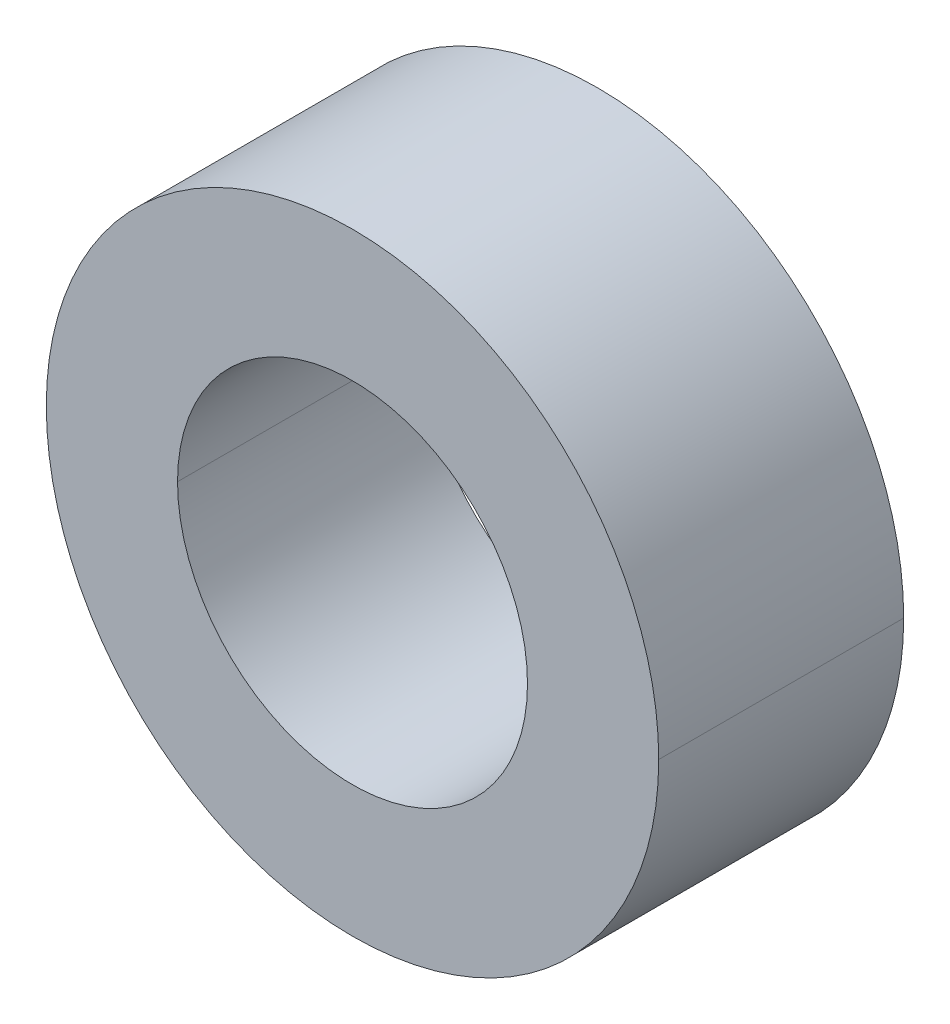
ISO-10303-21;
HEADER;
FILE_DESCRIPTION(('STEP AP214'),'2;1');
FILE_NAME('part.step','',(''),(''),'','','');
FILE_SCHEMA(('AUTOMOTIVE_DESIGN { 1 0 10303 214 1 1 1 1 }'));
ENDSEC;
DATA;
#1=APPLICATION_CONTEXT('core data for automotive mechanical design processes');
#2=APPLICATION_PROTOCOL_DEFINITION('international standard','automotive_design',2000,#1);
#3=PRODUCT_CONTEXT('',#1,'mechanical');
#4=PRODUCT('Part','Part','',(#3));
#5=PRODUCT_RELATED_PRODUCT_CATEGORY('part','',(#4));
#6=PRODUCT_DEFINITION_FORMATION('','',#4);
#7=PRODUCT_DEFINITION_CONTEXT('part definition',#1,'design');
#8=PRODUCT_DEFINITION('design','',#6,#7);
#9=PRODUCT_DEFINITION_SHAPE('','',#8);
#10=(LENGTH_UNIT() NAMED_UNIT(*) SI_UNIT(.MILLI.,.METRE.));
#11=(NAMED_UNIT(*) PLANE_ANGLE_UNIT() SI_UNIT($,.RADIAN.));
#12=(NAMED_UNIT(*) SI_UNIT($,.STERADIAN.) SOLID_ANGLE_UNIT());
#13=UNCERTAINTY_MEASURE_WITH_UNIT(LENGTH_MEASURE(1.E-05),#10,'distance_accuracy_value','');
#14=(GEOMETRIC_REPRESENTATION_CONTEXT(3) GLOBAL_UNCERTAINTY_ASSIGNED_CONTEXT((#13)) GLOBAL_UNIT_ASSIGNED_CONTEXT((#10,
#11,#12)) REPRESENTATION_CONTEXT('',''));
#15=CARTESIAN_POINT('',(0.,0.,0.));
#16=DIRECTION('',(0.,0.,1.));
#17=DIRECTION('',(1.,0.,0.));
#18=AXIS2_PLACEMENT_3D('',#15,#16,#17);
#19=CARTESIAN_POINT('',(0.403421843265389,-40.0666634220304,14.));
#20=DIRECTION('',(0.,0.,-1.));
#21=DIRECTION('',(-1.,0.,0.));
#22=AXIS2_PLACEMENT_3D('',#19,#20,#21);
#23=CYLINDRICAL_SURFACE('',#22,10.);
#24=DIRECTION('',(0.,0.,-1.));
#25=VECTOR('',#24,1.);
#26=CARTESIAN_POINT('',(10.4034218432654,-40.0666634220304,14.));
#27=LINE('',#26,#25);
#28=CARTESIAN_POINT('',(10.4034218432654,-40.0666634220304,14.));
#29=VERTEX_POINT('',#28);
#30=CARTESIAN_POINT('',(10.4034218432654,-40.0666634220304,0.));
#31=VERTEX_POINT('',#30);
#32=EDGE_CURVE('E21',#29,#31,#27,.T.);
#33=ORIENTED_EDGE('',*,*,#32,.F.);
#34=CARTESIAN_POINT('',(0.403421843265389,-40.0666634220304,14.));
#35=DIRECTION('',(0.,0.,1.));
#36=DIRECTION('',(1.,0.,0.));
#37=AXIS2_PLACEMENT_3D('',#34,#35,#36);
#38=CIRCLE('',#37,10.);
#39=CARTESIAN_POINT('',(-9.59657815673461,-40.0666634220304,14.));
#40=VERTEX_POINT('',#39);
#41=EDGE_CURVE('E75',#29,#40,#38,.T.);
#42=ORIENTED_EDGE('',*,*,#41,.T.);
#43=DIRECTION('',(0.,0.,-1.));
#44=VECTOR('',#43,1.);
#45=CARTESIAN_POINT('',(-9.59657815673461,-40.0666634220304,14.));
#46=LINE('',#45,#44);
#47=CARTESIAN_POINT('',(-9.59657815673461,-40.0666634220304,0.));
#48=VERTEX_POINT('',#47);
#49=EDGE_CURVE('E88',#40,#48,#46,.T.);
#50=ORIENTED_EDGE('',*,*,#49,.T.);
#51=CARTESIAN_POINT('',(0.403421843265389,-40.0666634220304,0.));
#52=DIRECTION('',(0.,0.,1.));
#53=DIRECTION('',(1.,0.,0.));
#54=AXIS2_PLACEMENT_3D('',#51,#52,#53);
#55=CIRCLE('',#54,10.);
#56=EDGE_CURVE('E11',#31,#48,#55,.T.);
#57=ORIENTED_EDGE('',*,*,#56,.F.);
#58=EDGE_LOOP('',(#33,#42,#50,#57));
#59=FACE_BOUND('',#58,.T.);
#60=ADVANCED_FACE('F17',(#59),#23,.F.);
#61=CARTESIAN_POINT('',(0.403421843265389,-40.0666634220304,14.));
#62=DIRECTION('',(0.,0.,-1.));
#63=DIRECTION('',(-1.,0.,0.));
#64=AXIS2_PLACEMENT_3D('',#61,#62,#63);
#65=CYLINDRICAL_SURFACE('',#64,17.5);
#66=DIRECTION('',(0.,0.,-1.));
#67=VECTOR('',#66,1.);
#68=CARTESIAN_POINT('',(17.9034218432654,-40.0666634220304,14.));
#69=LINE('',#68,#67);
#70=CARTESIAN_POINT('',(17.9034218432654,-40.0666634220304,14.));
#71=VERTEX_POINT('',#70);
#72=CARTESIAN_POINT('',(17.9034218432654,-40.0666634220304,0.));
#73=VERTEX_POINT('',#72);
#74=EDGE_CURVE('E79',#71,#73,#69,.T.);
#75=ORIENTED_EDGE('',*,*,#74,.F.);
#76=CARTESIAN_POINT('',(0.403421843265389,-40.0666634220304,14.));
#77=DIRECTION('',(0.,0.,1.));
#78=DIRECTION('',(1.,0.,0.));
#79=AXIS2_PLACEMENT_3D('',#76,#77,#78);
#80=CIRCLE('',#79,17.5);
#81=CARTESIAN_POINT('',(-17.0965781567346,-40.0666634220304,14.));
#82=VERTEX_POINT('',#81);
#83=EDGE_CURVE('E69',#82,#71,#80,.T.);
#84=ORIENTED_EDGE('',*,*,#83,.F.);
#85=DIRECTION('',(0.,0.,-1.));
#86=VECTOR('',#85,1.);
#87=CARTESIAN_POINT('',(-17.0965781567346,-40.0666634220304,14.));
#88=LINE('',#87,#86);
#89=CARTESIAN_POINT('',(-17.0965781567346,-40.0666634220304,0.));
#90=VERTEX_POINT('',#89);
#91=EDGE_CURVE('E76',#82,#90,#88,.T.);
#92=ORIENTED_EDGE('',*,*,#91,.T.);
#93=CARTESIAN_POINT('',(0.403421843265389,-40.0666634220304,0.));
#94=DIRECTION('',(0.,0.,1.));
#95=DIRECTION('',(1.,0.,0.));
#96=AXIS2_PLACEMENT_3D('',#93,#94,#95);
#97=CIRCLE('',#96,17.5);
#98=EDGE_CURVE('E27',#90,#73,#97,.T.);
#99=ORIENTED_EDGE('',*,*,#98,.T.);
#100=EDGE_LOOP('',(#75,#84,#92,#99));
#101=FACE_BOUND('',#100,.T.);
#102=ADVANCED_FACE('F80',(#101),#65,.T.);
#103=CARTESIAN_POINT('',(0.403421843265389,-40.0666634220304,0.));
#104=DIRECTION('',(0.,0.,1.));
#105=DIRECTION('',(1.,0.,0.));
#106=AXIS2_PLACEMENT_3D('',#103,#104,#105);
#107=PLANE('',#106);
#108=CARTESIAN_POINT('',(0.403421843265389,-40.0666634220304,0.));
#109=DIRECTION('',(0.,0.,1.));
#110=DIRECTION('',(1.,0.,0.));
#111=AXIS2_PLACEMENT_3D('',#108,#109,#110);
#112=CIRCLE('',#111,10.);
#113=EDGE_CURVE('E95',#48,#31,#112,.T.);
#114=ORIENTED_EDGE('',*,*,#113,.T.);
#115=ORIENTED_EDGE('',*,*,#56,.T.);
#116=EDGE_LOOP('',(#114,#115));
#117=FACE_BOUND('',#116,.T.);
#118=ORIENTED_EDGE('',*,*,#98,.F.);
#119=CARTESIAN_POINT('',(0.403421843265389,-40.0666634220304,0.));
#120=DIRECTION('',(0.,0.,1.));
#121=DIRECTION('',(1.,0.,0.));
#122=AXIS2_PLACEMENT_3D('',#119,#120,#121);
#123=CIRCLE('',#122,17.5);
#124=EDGE_CURVE('E84',#73,#90,#123,.T.);
#125=ORIENTED_EDGE('',*,*,#124,.F.);
#126=EDGE_LOOP('',(#118,#125));
#127=FACE_BOUND('',#126,.T.);
#128=ADVANCED_FACE('F19',(#117,#127),#107,.F.);
#129=CARTESIAN_POINT('',(0.403421843265389,-40.0666634220304,14.));
#130=DIRECTION('',(0.,0.,1.));
#131=DIRECTION('',(1.,0.,0.));
#132=AXIS2_PLACEMENT_3D('',#129,#130,#131);
#133=PLANE('',#132);
#134=CARTESIAN_POINT('',(0.403421843265389,-40.0666634220304,14.));
#135=DIRECTION('',(0.,0.,1.));
#136=DIRECTION('',(1.,0.,0.));
#137=AXIS2_PLACEMENT_3D('',#134,#135,#136);
#138=CIRCLE('',#137,10.);
#139=EDGE_CURVE('E103',#40,#29,#138,.T.);
#140=ORIENTED_EDGE('',*,*,#139,.F.);
#141=ORIENTED_EDGE('',*,*,#41,.F.);
#142=EDGE_LOOP('',(#140,#141));
#143=FACE_BOUND('',#142,.T.);
#144=ORIENTED_EDGE('',*,*,#83,.T.);
#145=CARTESIAN_POINT('',(0.403421843265389,-40.0666634220304,14.));
#146=DIRECTION('',(0.,0.,1.));
#147=DIRECTION('',(1.,0.,0.));
#148=AXIS2_PLACEMENT_3D('',#145,#146,#147);
#149=CIRCLE('',#148,17.5);
#150=EDGE_CURVE('E72',#71,#82,#149,.T.);
#151=ORIENTED_EDGE('',*,*,#150,.T.);
#152=EDGE_LOOP('',(#144,#151));
#153=FACE_BOUND('',#152,.T.);
#154=ADVANCED_FACE('F70',(#143,#153),#133,.T.);
#155=CARTESIAN_POINT('',(0.403421843265389,-40.0666634220304,14.));
#156=DIRECTION('',(0.,0.,-1.));
#157=DIRECTION('',(-1.,0.,0.));
#158=AXIS2_PLACEMENT_3D('',#155,#156,#157);
#159=CYLINDRICAL_SURFACE('',#158,17.5);
#160=ORIENTED_EDGE('',*,*,#150,.F.);
#161=ORIENTED_EDGE('',*,*,#74,.T.);
#162=ORIENTED_EDGE('',*,*,#124,.T.);
#163=ORIENTED_EDGE('',*,*,#91,.F.);
#164=EDGE_LOOP('',(#160,#161,#162,#163));
#165=FACE_BOUND('',#164,.T.);
#166=ADVANCED_FACE('F86',(#165),#159,.T.);
#167=CARTESIAN_POINT('',(0.403421843265389,-40.0666634220304,14.));
#168=DIRECTION('',(0.,0.,-1.));
#169=DIRECTION('',(-1.,0.,0.));
#170=AXIS2_PLACEMENT_3D('',#167,#168,#169);
#171=CYLINDRICAL_SURFACE('',#170,10.);
#172=ORIENTED_EDGE('',*,*,#139,.T.);
#173=ORIENTED_EDGE('',*,*,#32,.T.);
#174=ORIENTED_EDGE('',*,*,#113,.F.);
#175=ORIENTED_EDGE('',*,*,#49,.F.);
#176=EDGE_LOOP('',(#172,#173,#174,#175));
#177=FACE_BOUND('',#176,.T.);
#178=ADVANCED_FACE('F121',(#177),#171,.F.);
#179=CLOSED_SHELL('',(#60,#102,#128,#154,#166,#178));
#180=MANIFOLD_SOLID_BREP('B1',#179);
#181=ADVANCED_BREP_SHAPE_REPRESENTATION('',(#18,#180),#14);
#182=SHAPE_DEFINITION_REPRESENTATION(#9,#181);
ENDSEC;
END-ISO-10303-21;
